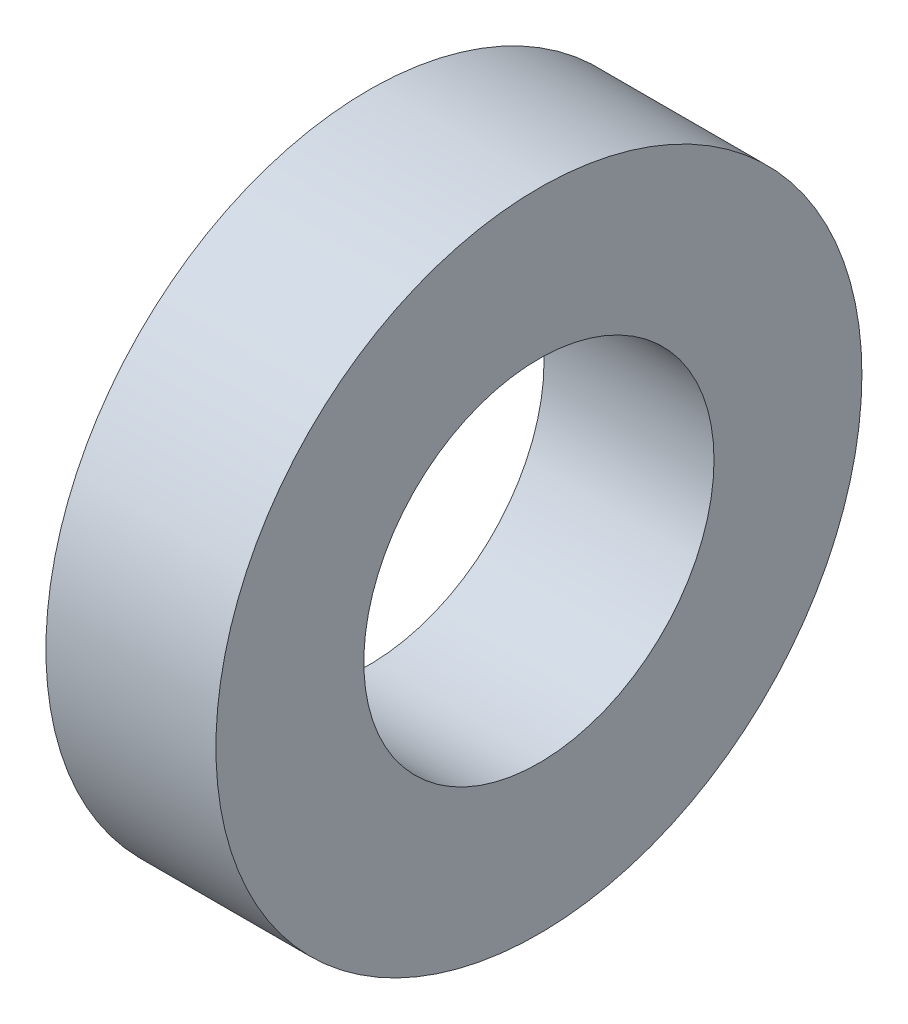
ISO-10303-21;
HEADER;
FILE_DESCRIPTION(('STEP AP214'),'2;1');
FILE_NAME('part.step','',(''),(''),'','','');
FILE_SCHEMA(('AUTOMOTIVE_DESIGN { 1 0 10303 214 1 1 1 1 }'));
ENDSEC;
DATA;
#1=APPLICATION_CONTEXT('core data for automotive mechanical design processes');
#2=APPLICATION_PROTOCOL_DEFINITION('international standard','automotive_design',2000,#1);
#3=PRODUCT_CONTEXT('',#1,'mechanical');
#4=PRODUCT('Part','Part','',(#3));
#5=PRODUCT_RELATED_PRODUCT_CATEGORY('part','',(#4));
#6=PRODUCT_DEFINITION_FORMATION('','',#4);
#7=PRODUCT_DEFINITION_CONTEXT('part definition',#1,'design');
#8=PRODUCT_DEFINITION('design','',#6,#7);
#9=PRODUCT_DEFINITION_SHAPE('','',#8);
#10=(LENGTH_UNIT() NAMED_UNIT(*) SI_UNIT(.MILLI.,.METRE.));
#11=(NAMED_UNIT(*) PLANE_ANGLE_UNIT() SI_UNIT($,.RADIAN.));
#12=(NAMED_UNIT(*) SI_UNIT($,.STERADIAN.) SOLID_ANGLE_UNIT());
#13=UNCERTAINTY_MEASURE_WITH_UNIT(LENGTH_MEASURE(1.E-05),#10,'distance_accuracy_value','');
#14=(GEOMETRIC_REPRESENTATION_CONTEXT(3) GLOBAL_UNCERTAINTY_ASSIGNED_CONTEXT((#13)) GLOBAL_UNIT_ASSIGNED_CONTEXT((#10,
#11,#12)) REPRESENTATION_CONTEXT('',''));
#15=CARTESIAN_POINT('',(0.,0.,0.));
#16=DIRECTION('',(0.,0.,1.));
#17=DIRECTION('',(1.,0.,0.));
#18=AXIS2_PLACEMENT_3D('',#15,#16,#17);
#19=CARTESIAN_POINT('',(25.,0.,0.));
#20=DIRECTION('',(1.,0.,0.));
#21=DIRECTION('',(0.,0.,-1.));
#22=AXIS2_PLACEMENT_3D('',#19,#20,#21);
#23=PLANE('',#22);
#24=CARTESIAN_POINT('',(25.,0.,0.));
#25=DIRECTION('',(1.,0.,0.));
#26=DIRECTION('',(0.,0.,-1.));
#27=AXIS2_PLACEMENT_3D('',#24,#25,#26);
#28=CIRCLE('',#27,47.5);
#29=CARTESIAN_POINT('',(25.,0.,-47.5));
#30=VERTEX_POINT('',#29);
#31=EDGE_CURVE('E10',#30,#30,#28,.T.);
#32=ORIENTED_EDGE('',*,*,#31,.T.);
#33=EDGE_LOOP('',(#32));
#34=FACE_BOUND('',#33,.T.);
#35=CARTESIAN_POINT('',(25.,0.,0.));
#36=DIRECTION('',(1.,0.,0.));
#37=DIRECTION('',(0.,0.,-1.));
#38=AXIS2_PLACEMENT_3D('',#35,#36,#37);
#39=CIRCLE('',#38,25.75);
#40=CARTESIAN_POINT('',(25.,0.,-25.75));
#41=VERTEX_POINT('',#40);
#42=EDGE_CURVE('E43',#41,#41,#39,.T.);
#43=ORIENTED_EDGE('',*,*,#42,.F.);
#44=EDGE_LOOP('',(#43));
#45=FACE_BOUND('',#44,.T.);
#46=ADVANCED_FACE('F32',(#34,#45),#23,.T.);
#47=CARTESIAN_POINT('',(0.,0.,0.));
#48=DIRECTION('',(1.,0.,0.));
#49=DIRECTION('',(0.,0.,-1.));
#50=AXIS2_PLACEMENT_3D('',#47,#48,#49);
#51=PLANE('',#50);
#52=CARTESIAN_POINT('',(0.,0.,0.));
#53=DIRECTION('',(1.,0.,0.));
#54=DIRECTION('',(0.,0.,-1.));
#55=AXIS2_PLACEMENT_3D('',#52,#53,#54);
#56=CIRCLE('',#55,47.5);
#57=CARTESIAN_POINT('',(0.,0.,-47.5));
#58=VERTEX_POINT('',#57);
#59=EDGE_CURVE('E36',#58,#58,#56,.T.);
#60=ORIENTED_EDGE('',*,*,#59,.F.);
#61=EDGE_LOOP('',(#60));
#62=FACE_BOUND('',#61,.T.);
#63=CARTESIAN_POINT('',(0.,0.,0.));
#64=DIRECTION('',(1.,0.,0.));
#65=DIRECTION('',(0.,0.,-1.));
#66=AXIS2_PLACEMENT_3D('',#63,#64,#65);
#67=CIRCLE('',#66,25.75);
#68=CARTESIAN_POINT('',(0.,0.,-25.75));
#69=VERTEX_POINT('',#68);
#70=EDGE_CURVE('E45',#69,#69,#67,.T.);
#71=ORIENTED_EDGE('',*,*,#70,.T.);
#72=EDGE_LOOP('',(#71));
#73=FACE_BOUND('',#72,.T.);
#74=ADVANCED_FACE('F55',(#62,#73),#51,.F.);
#75=CARTESIAN_POINT('',(25.,0.,0.));
#76=DIRECTION('',(-1.,0.,0.));
#77=DIRECTION('',(0.,0.,1.));
#78=AXIS2_PLACEMENT_3D('',#75,#76,#77);
#79=CYLINDRICAL_SURFACE('',#78,47.5);
#80=ORIENTED_EDGE('',*,*,#31,.F.);
#81=EDGE_LOOP('',(#80));
#82=FACE_BOUND('',#81,.T.);
#83=ORIENTED_EDGE('',*,*,#59,.T.);
#84=EDGE_LOOP('',(#83));
#85=FACE_BOUND('',#84,.T.);
#86=ADVANCED_FACE('F34',(#82,#85),#79,.T.);
#87=CARTESIAN_POINT('',(25.,0.,0.));
#88=DIRECTION('',(-1.,0.,0.));
#89=DIRECTION('',(0.,0.,1.));
#90=AXIS2_PLACEMENT_3D('',#87,#88,#89);
#91=CYLINDRICAL_SURFACE('',#90,25.75);
#92=ORIENTED_EDGE('',*,*,#42,.T.);
#93=EDGE_LOOP('',(#92));
#94=FACE_BOUND('',#93,.T.);
#95=ORIENTED_EDGE('',*,*,#70,.F.);
#96=EDGE_LOOP('',(#95));
#97=FACE_BOUND('',#96,.T.);
#98=ADVANCED_FACE('F51',(#94,#97),#91,.F.);
#99=CLOSED_SHELL('',(#46,#74,#86,#98));
#100=MANIFOLD_SOLID_BREP('B2',#99);
#101=ADVANCED_BREP_SHAPE_REPRESENTATION('',(#18,#100),#14);
#102=SHAPE_DEFINITION_REPRESENTATION(#9,#101);
ENDSEC;
END-ISO-10303-21;
